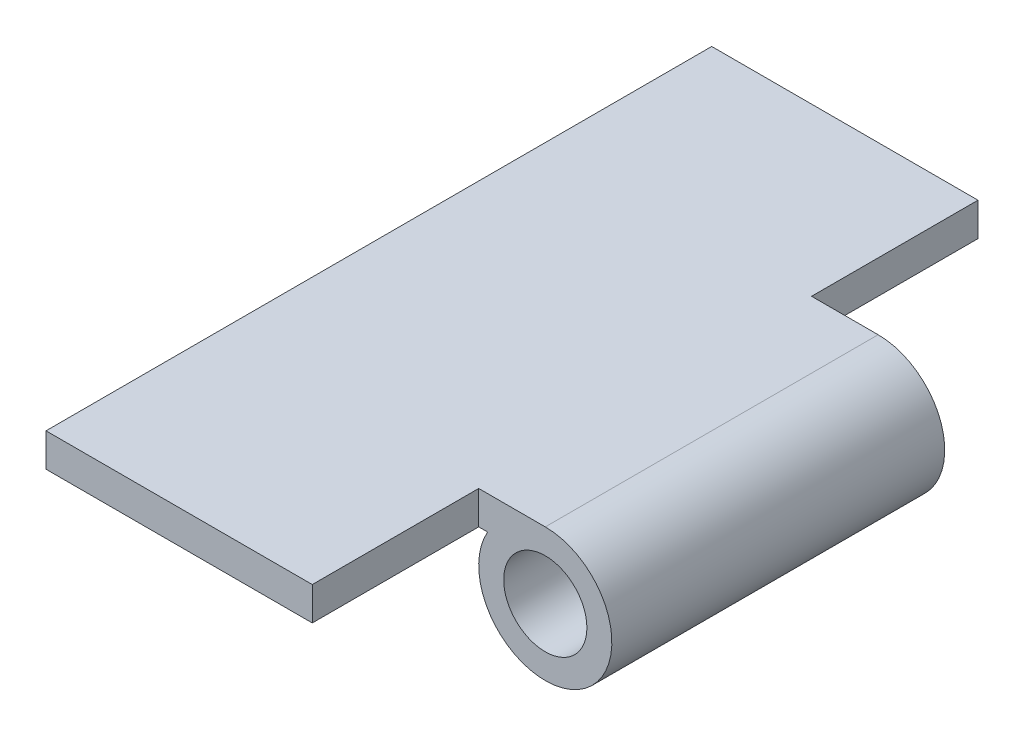
ISO-10303-21;
HEADER;
FILE_DESCRIPTION(('STEP AP214'),'2;1');
FILE_NAME('part.step','',(''),(''),'','','');
FILE_SCHEMA(('AUTOMOTIVE_DESIGN { 1 0 10303 214 1 1 1 1 }'));
ENDSEC;
DATA;
#1=APPLICATION_CONTEXT('core data for automotive mechanical design processes');
#2=APPLICATION_PROTOCOL_DEFINITION('international standard','automotive_design',2000,#1);
#3=PRODUCT_CONTEXT('',#1,'mechanical');
#4=PRODUCT('Part','Part','',(#3));
#5=PRODUCT_RELATED_PRODUCT_CATEGORY('part','',(#4));
#6=PRODUCT_DEFINITION_FORMATION('','',#4);
#7=PRODUCT_DEFINITION_CONTEXT('part definition',#1,'design');
#8=PRODUCT_DEFINITION('design','',#6,#7);
#9=PRODUCT_DEFINITION_SHAPE('','',#8);
#10=(LENGTH_UNIT() NAMED_UNIT(*) SI_UNIT(.MILLI.,.METRE.));
#11=(NAMED_UNIT(*) PLANE_ANGLE_UNIT() SI_UNIT($,.RADIAN.));
#12=(NAMED_UNIT(*) SI_UNIT($,.STERADIAN.) SOLID_ANGLE_UNIT());
#13=UNCERTAINTY_MEASURE_WITH_UNIT(LENGTH_MEASURE(1.E-05),#10,'distance_accuracy_value','');
#14=(GEOMETRIC_REPRESENTATION_CONTEXT(3) GLOBAL_UNCERTAINTY_ASSIGNED_CONTEXT((#13)) GLOBAL_UNIT_ASSIGNED_CONTEXT((#10,
#11,#12)) REPRESENTATION_CONTEXT('',''));
#15=CARTESIAN_POINT('',(0.,0.,0.));
#16=DIRECTION('',(0.,0.,1.));
#17=DIRECTION('',(1.,0.,0.));
#18=AXIS2_PLACEMENT_3D('',#15,#16,#17);
#19=CARTESIAN_POINT('',(0.,0.,-20.));
#20=DIRECTION('',(0.,0.,1.));
#21=DIRECTION('',(-1.,0.,0.));
#22=AXIS2_PLACEMENT_3D('',#19,#20,#21);
#23=CYLINDRICAL_SURFACE('',#22,4.);
#24=CARTESIAN_POINT('',(0.,0.,10.));
#25=DIRECTION('',(0.,0.,1.));
#26=DIRECTION('',(-0.866025403784429,0.500000000000017,0.));
#27=AXIS2_PLACEMENT_3D('',#24,#25,#26);
#28=CIRCLE('',#27,4.);
#29=CARTESIAN_POINT('',(-3.464101615138,2.,10.));
#30=VERTEX_POINT('',#29);
#31=CARTESIAN_POINT('',(0.,4.,10.));
#32=VERTEX_POINT('',#31);
#33=EDGE_CURVE('E154',#30,#32,#28,.T.);
#34=ORIENTED_EDGE('',*,*,#33,.F.);
#35=DIRECTION('',(0.,0.,1.));
#36=VECTOR('',#35,1.);
#37=CARTESIAN_POINT('',(-3.464101615138,2.,-10.));
#38=LINE('',#37,#36);
#39=CARTESIAN_POINT('',(-3.464101615138,2.,-10.));
#40=VERTEX_POINT('',#39);
#41=EDGE_CURVE('E181',#40,#30,#38,.T.);
#42=ORIENTED_EDGE('',*,*,#41,.F.);
#43=CARTESIAN_POINT('',(0.,0.,-10.));
#44=DIRECTION('',(0.,0.,-1.));
#45=DIRECTION('',(0.,1.,0.));
#46=AXIS2_PLACEMENT_3D('',#43,#44,#45);
#47=CIRCLE('',#46,4.);
#48=CARTESIAN_POINT('',(0.,4.,-10.));
#49=VERTEX_POINT('',#48);
#50=EDGE_CURVE('E149',#49,#40,#47,.T.);
#51=ORIENTED_EDGE('',*,*,#50,.F.);
#52=DIRECTION('',(0.,0.,1.));
#53=VECTOR('',#52,1.);
#54=CARTESIAN_POINT('',(0.,4.,-10.));
#55=LINE('',#54,#53);
#56=EDGE_CURVE('E102',#49,#32,#55,.T.);
#57=ORIENTED_EDGE('',*,*,#56,.T.);
#58=EDGE_LOOP('',(#34,#42,#51,#57));
#59=FACE_BOUND('',#58,.T.);
#60=ADVANCED_FACE('F16',(#59),#23,.T.);
#61=CARTESIAN_POINT('',(-20.,4.,-20.));
#62=DIRECTION('',(-1.,0.,0.));
#63=DIRECTION('',(0.,0.,1.));
#64=AXIS2_PLACEMENT_3D('',#61,#62,#63);
#65=PLANE('',#64);
#66=DIRECTION('',(0.,-1.,0.));
#67=VECTOR('',#66,1.);
#68=CARTESIAN_POINT('',(-20.,4.,-20.));
#69=LINE('',#68,#67);
#70=CARTESIAN_POINT('',(-20.,4.,-20.));
#71=VERTEX_POINT('',#70);
#72=CARTESIAN_POINT('',(-20.,2.,-20.));
#73=VERTEX_POINT('',#72);
#74=EDGE_CURVE('E124',#71,#73,#69,.T.);
#75=ORIENTED_EDGE('',*,*,#74,.T.);
#76=DIRECTION('',(0.,0.,1.));
#77=VECTOR('',#76,1.);
#78=CARTESIAN_POINT('',(-20.,2.,-20.));
#79=LINE('',#78,#77);
#80=CARTESIAN_POINT('',(-20.,2.,20.));
#81=VERTEX_POINT('',#80);
#82=EDGE_CURVE('E121',#73,#81,#79,.T.);
#83=ORIENTED_EDGE('',*,*,#82,.T.);
#84=DIRECTION('',(0.,-1.,0.));
#85=VECTOR('',#84,1.);
#86=CARTESIAN_POINT('',(-20.,4.,20.));
#87=LINE('',#86,#85);
#88=CARTESIAN_POINT('',(-20.,4.,20.));
#89=VERTEX_POINT('',#88);
#90=EDGE_CURVE('E11',#89,#81,#87,.T.);
#91=ORIENTED_EDGE('',*,*,#90,.F.);
#92=DIRECTION('',(0.,0.,1.));
#93=VECTOR('',#92,1.);
#94=CARTESIAN_POINT('',(-20.,4.,-20.));
#95=LINE('',#94,#93);
#96=EDGE_CURVE('E175',#71,#89,#95,.T.);
#97=ORIENTED_EDGE('',*,*,#96,.F.);
#98=EDGE_LOOP('',(#75,#83,#91,#97));
#99=FACE_BOUND('',#98,.T.);
#100=ADVANCED_FACE('F122',(#99),#65,.T.);
#101=CARTESIAN_POINT('',(0.,0.,20.));
#102=DIRECTION('',(0.,0.,1.));
#103=DIRECTION('',(0.,-1.,0.));
#104=AXIS2_PLACEMENT_3D('',#101,#102,#103);
#105=PLANE('',#104);
#106=DIRECTION('',(0.,-1.,0.));
#107=VECTOR('',#106,1.);
#108=CARTESIAN_POINT('',(-4.,4.,20.));
#109=LINE('',#108,#107);
#110=CARTESIAN_POINT('',(-4.,4.,20.));
#111=VERTEX_POINT('',#110);
#112=CARTESIAN_POINT('',(-4.,2.,20.));
#113=VERTEX_POINT('',#112);
#114=EDGE_CURVE('E27',#111,#113,#109,.T.);
#115=ORIENTED_EDGE('',*,*,#114,.F.);
#116=DIRECTION('',(-1.,0.,0.));
#117=VECTOR('',#116,1.);
#118=CARTESIAN_POINT('',(-4.,4.,20.));
#119=LINE('',#118,#117);
#120=EDGE_CURVE('E117',#111,#89,#119,.T.);
#121=ORIENTED_EDGE('',*,*,#120,.T.);
#122=ORIENTED_EDGE('',*,*,#90,.T.);
#123=DIRECTION('',(1.,0.,0.));
#124=VECTOR('',#123,1.);
#125=CARTESIAN_POINT('',(-20.,2.,20.));
#126=LINE('',#125,#124);
#127=EDGE_CURVE('E114',#81,#113,#126,.T.);
#128=ORIENTED_EDGE('',*,*,#127,.T.);
#129=EDGE_LOOP('',(#115,#121,#122,#128));
#130=FACE_BOUND('',#129,.T.);
#131=ADVANCED_FACE('F112',(#130),#105,.T.);
#132=CARTESIAN_POINT('',(-4.,4.,10.));
#133=DIRECTION('',(-1.,0.,0.));
#134=DIRECTION('',(0.,0.,1.));
#135=AXIS2_PLACEMENT_3D('',#132,#133,#134);
#136=PLANE('',#135);
#137=ORIENTED_EDGE('',*,*,#114,.T.);
#138=DIRECTION('',(0.,0.,-1.));
#139=VECTOR('',#138,1.);
#140=CARTESIAN_POINT('',(-4.,2.,20.));
#141=LINE('',#140,#139);
#142=CARTESIAN_POINT('',(-4.,2.,10.));
#143=VERTEX_POINT('',#142);
#144=EDGE_CURVE('E134',#113,#143,#141,.T.);
#145=ORIENTED_EDGE('',*,*,#144,.T.);
#146=DIRECTION('',(0.,-1.,0.));
#147=VECTOR('',#146,1.);
#148=CARTESIAN_POINT('',(-4.,4.,10.));
#149=LINE('',#148,#147);
#150=CARTESIAN_POINT('',(-4.,4.,10.));
#151=VERTEX_POINT('',#150);
#152=EDGE_CURVE('E155',#151,#143,#149,.T.);
#153=ORIENTED_EDGE('',*,*,#152,.F.);
#154=DIRECTION('',(0.,0.,-1.));
#155=VECTOR('',#154,1.);
#156=CARTESIAN_POINT('',(-4.,4.,20.));
#157=LINE('',#156,#155);
#158=EDGE_CURVE('E165',#111,#151,#157,.T.);
#159=ORIENTED_EDGE('',*,*,#158,.F.);
#160=EDGE_LOOP('',(#137,#145,#153,#159));
#161=FACE_BOUND('',#160,.T.);
#162=ADVANCED_FACE('F18',(#161),#136,.F.);
#163=CARTESIAN_POINT('',(0.,4.,-20.));
#164=DIRECTION('',(0.,1.,0.));
#165=DIRECTION('',(0.,0.,-1.));
#166=AXIS2_PLACEMENT_3D('',#163,#164,#165);
#167=PLANE('',#166);
#168=DIRECTION('',(-1.,0.,0.));
#169=VECTOR('',#168,1.);
#170=CARTESIAN_POINT('',(0.,4.,10.));
#171=LINE('',#170,#169);
#172=EDGE_CURVE('E158',#32,#151,#171,.T.);
#173=ORIENTED_EDGE('',*,*,#172,.F.);
#174=ORIENTED_EDGE('',*,*,#56,.F.);
#175=DIRECTION('',(-1.,0.,0.));
#176=VECTOR('',#175,1.);
#177=CARTESIAN_POINT('',(0.,4.,-10.));
#178=LINE('',#177,#176);
#179=CARTESIAN_POINT('',(-4.,4.,-10.));
#180=VERTEX_POINT('',#179);
#181=EDGE_CURVE('E147',#49,#180,#178,.T.);
#182=ORIENTED_EDGE('',*,*,#181,.T.);
#183=DIRECTION('',(0.,0.,1.));
#184=VECTOR('',#183,1.);
#185=CARTESIAN_POINT('',(-4.,4.,-20.));
#186=LINE('',#185,#184);
#187=CARTESIAN_POINT('',(-4.,4.,-20.));
#188=VERTEX_POINT('',#187);
#189=EDGE_CURVE('E184',#188,#180,#186,.T.);
#190=ORIENTED_EDGE('',*,*,#189,.F.);
#191=DIRECTION('',(-1.,0.,0.));
#192=VECTOR('',#191,1.);
#193=CARTESIAN_POINT('',(-4.,4.,-20.));
#194=LINE('',#193,#192);
#195=EDGE_CURVE('E178',#188,#71,#194,.T.);
#196=ORIENTED_EDGE('',*,*,#195,.T.);
#197=ORIENTED_EDGE('',*,*,#96,.T.);
#198=ORIENTED_EDGE('',*,*,#120,.F.);
#199=ORIENTED_EDGE('',*,*,#158,.T.);
#200=EDGE_LOOP('',(#173,#174,#182,#190,#196,#197,#198,#199));
#201=FACE_BOUND('',#200,.T.);
#202=ADVANCED_FACE('F221',(#201),#167,.T.);
#203=CARTESIAN_POINT('',(-4.,4.,-10.));
#204=DIRECTION('',(0.,0.,1.));
#205=DIRECTION('',(0.,-1.,0.));
#206=AXIS2_PLACEMENT_3D('',#203,#204,#205);
#207=PLANE('',#206);
#208=CARTESIAN_POINT('',(0.,0.,-10.));
#209=DIRECTION('',(0.,0.,1.));
#210=DIRECTION('',(1.,0.,0.));
#211=AXIS2_PLACEMENT_3D('',#208,#209,#210);
#212=CIRCLE('',#211,2.5);
#213=CARTESIAN_POINT('',(2.5,0.,-10.));
#214=VERTEX_POINT('',#213);
#215=EDGE_CURVE('E92',#214,#214,#212,.T.);
#216=ORIENTED_EDGE('',*,*,#215,.T.);
#217=EDGE_LOOP('',(#216));
#218=FACE_BOUND('',#217,.T.);
#219=ORIENTED_EDGE('',*,*,#181,.F.);
#220=ORIENTED_EDGE('',*,*,#50,.T.);
#221=DIRECTION('',(-1.,0.,0.));
#222=VECTOR('',#221,1.);
#223=CARTESIAN_POINT('',(-3.464101615138,2.,-10.));
#224=LINE('',#223,#222);
#225=CARTESIAN_POINT('',(-4.,2.,-10.));
#226=VERTEX_POINT('',#225);
#227=EDGE_CURVE('E129',#40,#226,#224,.T.);
#228=ORIENTED_EDGE('',*,*,#227,.T.);
#229=DIRECTION('',(0.,-1.,0.));
#230=VECTOR('',#229,1.);
#231=CARTESIAN_POINT('',(-4.,4.,-10.));
#232=LINE('',#231,#230);
#233=EDGE_CURVE('E187',#180,#226,#232,.T.);
#234=ORIENTED_EDGE('',*,*,#233,.F.);
#235=EDGE_LOOP('',(#219,#220,#228,#234));
#236=FACE_BOUND('',#235,.T.);
#237=ADVANCED_FACE('F223',(#218,#236),#207,.F.);
#238=CARTESIAN_POINT('',(0.,0.,-20.));
#239=DIRECTION('',(0.,0.,1.));
#240=DIRECTION('',(-1.,0.,0.));
#241=AXIS2_PLACEMENT_3D('',#238,#239,#240);
#242=CYLINDRICAL_SURFACE('',#241,2.5);
#243=ORIENTED_EDGE('',*,*,#215,.F.);
#244=EDGE_LOOP('',(#243));
#245=FACE_BOUND('',#244,.T.);
#246=CARTESIAN_POINT('',(0.,0.,10.));
#247=DIRECTION('',(0.,0.,1.));
#248=DIRECTION('',(1.,0.,0.));
#249=AXIS2_PLACEMENT_3D('',#246,#247,#248);
#250=CIRCLE('',#249,2.5);
#251=CARTESIAN_POINT('',(2.5,0.,10.));
#252=VERTEX_POINT('',#251);
#253=EDGE_CURVE('E148',#252,#252,#250,.T.);
#254=ORIENTED_EDGE('',*,*,#253,.T.);
#255=EDGE_LOOP('',(#254));
#256=FACE_BOUND('',#255,.T.);
#257=ADVANCED_FACE('F229',(#245,#256),#242,.F.);
#258=CARTESIAN_POINT('',(4.,4.,10.));
#259=DIRECTION('',(0.,0.,-1.));
#260=DIRECTION('',(0.,-1.,0.));
#261=AXIS2_PLACEMENT_3D('',#258,#259,#260);
#262=PLANE('',#261);
#263=ORIENTED_EDGE('',*,*,#253,.F.);
#264=EDGE_LOOP('',(#263));
#265=FACE_BOUND('',#264,.T.);
#266=ORIENTED_EDGE('',*,*,#172,.T.);
#267=ORIENTED_EDGE('',*,*,#152,.T.);
#268=DIRECTION('',(-1.,0.,0.));
#269=VECTOR('',#268,1.);
#270=CARTESIAN_POINT('',(-3.464101615138,2.,10.));
#271=LINE('',#270,#269);
#272=EDGE_CURVE('E141',#30,#143,#271,.T.);
#273=ORIENTED_EDGE('',*,*,#272,.F.);
#274=ORIENTED_EDGE('',*,*,#33,.T.);
#275=EDGE_LOOP('',(#266,#267,#273,#274));
#276=FACE_BOUND('',#275,.T.);
#277=ADVANCED_FACE('F219',(#265,#276),#262,.F.);
#278=CARTESIAN_POINT('',(-20.,2.,-20.));
#279=DIRECTION('',(0.,-1.,0.));
#280=DIRECTION('',(-1.,0.,0.));
#281=AXIS2_PLACEMENT_3D('',#278,#279,#280);
#282=PLANE('',#281);
#283=ORIENTED_EDGE('',*,*,#272,.T.);
#284=ORIENTED_EDGE('',*,*,#144,.F.);
#285=ORIENTED_EDGE('',*,*,#127,.F.);
#286=ORIENTED_EDGE('',*,*,#82,.F.);
#287=DIRECTION('',(1.,0.,0.));
#288=VECTOR('',#287,1.);
#289=CARTESIAN_POINT('',(-20.,2.,-20.));
#290=LINE('',#289,#288);
#291=CARTESIAN_POINT('',(-4.,2.,-20.));
#292=VERTEX_POINT('',#291);
#293=EDGE_CURVE('E159',#73,#292,#290,.T.);
#294=ORIENTED_EDGE('',*,*,#293,.T.);
#295=DIRECTION('',(0.,0.,1.));
#296=VECTOR('',#295,1.);
#297=CARTESIAN_POINT('',(-4.,2.,-20.));
#298=LINE('',#297,#296);
#299=EDGE_CURVE('E20',#292,#226,#298,.T.);
#300=ORIENTED_EDGE('',*,*,#299,.T.);
#301=ORIENTED_EDGE('',*,*,#227,.F.);
#302=ORIENTED_EDGE('',*,*,#41,.T.);
#303=EDGE_LOOP('',(#283,#284,#285,#286,#294,#300,#301,#302));
#304=FACE_BOUND('',#303,.T.);
#305=ADVANCED_FACE('F132',(#304),#282,.T.);
#306=CARTESIAN_POINT('',(-4.,4.,-25.));
#307=DIRECTION('',(-1.,0.,0.));
#308=DIRECTION('',(0.,0.,1.));
#309=AXIS2_PLACEMENT_3D('',#306,#307,#308);
#310=PLANE('',#309);
#311=DIRECTION('',(0.,-1.,0.));
#312=VECTOR('',#311,1.);
#313=CARTESIAN_POINT('',(-4.,4.,-20.));
#314=LINE('',#313,#312);
#315=EDGE_CURVE('E162',#188,#292,#314,.T.);
#316=ORIENTED_EDGE('',*,*,#315,.F.);
#317=ORIENTED_EDGE('',*,*,#189,.T.);
#318=ORIENTED_EDGE('',*,*,#233,.T.);
#319=ORIENTED_EDGE('',*,*,#299,.F.);
#320=EDGE_LOOP('',(#316,#317,#318,#319));
#321=FACE_BOUND('',#320,.T.);
#322=ADVANCED_FACE('F241',(#321),#310,.F.);
#323=CARTESIAN_POINT('',(0.,0.,-20.));
#324=DIRECTION('',(0.,0.,1.));
#325=DIRECTION('',(0.,-1.,0.));
#326=AXIS2_PLACEMENT_3D('',#323,#324,#325);
#327=PLANE('',#326);
#328=ORIENTED_EDGE('',*,*,#315,.T.);
#329=ORIENTED_EDGE('',*,*,#293,.F.);
#330=ORIENTED_EDGE('',*,*,#74,.F.);
#331=ORIENTED_EDGE('',*,*,#195,.F.);
#332=EDGE_LOOP('',(#328,#329,#330,#331));
#333=FACE_BOUND('',#332,.T.);
#334=ADVANCED_FACE('F244',(#333),#327,.F.);
#335=CLOSED_SHELL('',(#60,#100,#131,#162,#202,#237,#257,#277,#305,#322,#334));
#336=MANIFOLD_SOLID_BREP('B1',#335);
#337=ADVANCED_BREP_SHAPE_REPRESENTATION('',(#18,#336),#14);
#338=SHAPE_DEFINITION_REPRESENTATION(#9,#337);
ENDSEC;
END-ISO-10303-21;
